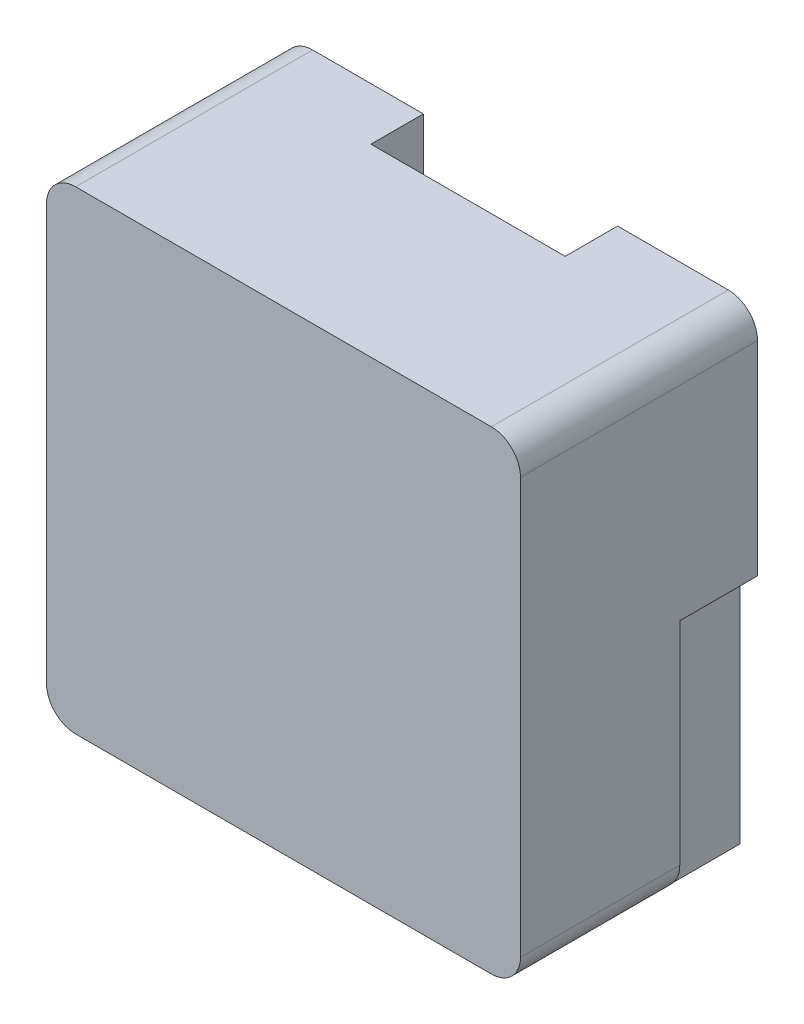
ISO-10303-21;
HEADER;
FILE_DESCRIPTION(('STEP AP214'),'2;1');
FILE_NAME('part.step','',(''),(''),'','','');
FILE_SCHEMA(('AUTOMOTIVE_DESIGN { 1 0 10303 214 1 1 1 1 }'));
ENDSEC;
DATA;
#1=APPLICATION_CONTEXT('core data for automotive mechanical design processes');
#2=APPLICATION_PROTOCOL_DEFINITION('international standard','automotive_design',2000,#1);
#3=PRODUCT_CONTEXT('',#1,'mechanical');
#4=PRODUCT('Part','Part','',(#3));
#5=PRODUCT_RELATED_PRODUCT_CATEGORY('part','',(#4));
#6=PRODUCT_DEFINITION_FORMATION('','',#4);
#7=PRODUCT_DEFINITION_CONTEXT('part definition',#1,'design');
#8=PRODUCT_DEFINITION('design','',#6,#7);
#9=PRODUCT_DEFINITION_SHAPE('','',#8);
#10=(LENGTH_UNIT() NAMED_UNIT(*) SI_UNIT(.MILLI.,.METRE.));
#11=(NAMED_UNIT(*) PLANE_ANGLE_UNIT() SI_UNIT($,.RADIAN.));
#12=(NAMED_UNIT(*) SI_UNIT($,.STERADIAN.) SOLID_ANGLE_UNIT());
#13=UNCERTAINTY_MEASURE_WITH_UNIT(LENGTH_MEASURE(1.E-05),#10,'distance_accuracy_value','');
#14=(GEOMETRIC_REPRESENTATION_CONTEXT(3) GLOBAL_UNCERTAINTY_ASSIGNED_CONTEXT((#13)) GLOBAL_UNIT_ASSIGNED_CONTEXT((#10,
#11,#12)) REPRESENTATION_CONTEXT('',''));
#15=CARTESIAN_POINT('',(0.,0.,0.));
#16=DIRECTION('',(0.,0.,1.));
#17=DIRECTION('',(1.,0.,0.));
#18=AXIS2_PLACEMENT_3D('',#15,#16,#17);
#19=CARTESIAN_POINT('',(0.,0.117632789782286,-0.508));
#20=DIRECTION('',(0.,0.,-1.));
#21=DIRECTION('',(-1.,0.,0.));
#22=AXIS2_PLACEMENT_3D('',#19,#20,#21);
#23=PLANE('',#22);
#24=CARTESIAN_POINT('',(2.7178,-2.7178,-0.508000000000003));
#25=DIRECTION('',(0.,0.,-1.));
#26=DIRECTION('',(1.,0.,0.));
#27=AXIS2_PLACEMENT_3D('',#24,#25,#26);
#28=CIRCLE('',#27,0.381);
#29=CARTESIAN_POINT('',(3.0988,-2.7178,-0.508));
#30=VERTEX_POINT('',#29);
#31=CARTESIAN_POINT('',(2.7178,-3.0988,-0.508));
#32=VERTEX_POINT('',#31);
#33=EDGE_CURVE('E11',#30,#32,#28,.T.);
#34=ORIENTED_EDGE('',*,*,#33,.F.);
#35=DIRECTION('',(0.,-1.,0.));
#36=VECTOR('',#35,1.);
#37=CARTESIAN_POINT('',(3.0988,-1.4905836051089,-0.508));
#38=LINE('',#37,#36);
#39=CARTESIAN_POINT('',(3.0988,2.7178,-0.508));
#40=VERTEX_POINT('',#39);
#41=EDGE_CURVE('E24',#40,#30,#38,.T.);
#42=ORIENTED_EDGE('',*,*,#41,.F.);
#43=CARTESIAN_POINT('',(2.7178,2.7178,-0.508000000000003));
#44=DIRECTION('',(0.,0.,-1.));
#45=DIRECTION('',(0.,1.,0.));
#46=AXIS2_PLACEMENT_3D('',#43,#44,#45);
#47=CIRCLE('',#46,0.381);
#48=CARTESIAN_POINT('',(2.7178,3.0988,-0.508));
#49=VERTEX_POINT('',#48);
#50=EDGE_CURVE('E299',#49,#40,#47,.T.);
#51=ORIENTED_EDGE('',*,*,#50,.F.);
#52=DIRECTION('',(1.,0.,0.));
#53=VECTOR('',#52,1.);
#54=CARTESIAN_POINT('',(1.5494,3.0988,-0.508));
#55=LINE('',#54,#53);
#56=CARTESIAN_POINT('',(-2.7178,3.0988,-0.508));
#57=VERTEX_POINT('',#56);
#58=EDGE_CURVE('E296',#57,#49,#55,.T.);
#59=ORIENTED_EDGE('',*,*,#58,.F.);
#60=CARTESIAN_POINT('',(-2.7178,2.7178,-0.508000000000003));
#61=DIRECTION('',(0.,0.,-1.));
#62=DIRECTION('',(-1.,0.,0.));
#63=AXIS2_PLACEMENT_3D('',#60,#61,#62);
#64=CIRCLE('',#63,0.381);
#65=CARTESIAN_POINT('',(-3.0988,2.7178,-0.508));
#66=VERTEX_POINT('',#65);
#67=EDGE_CURVE('E293',#66,#57,#64,.T.);
#68=ORIENTED_EDGE('',*,*,#67,.F.);
#69=DIRECTION('',(0.,1.,0.));
#70=VECTOR('',#69,1.);
#71=CARTESIAN_POINT('',(-3.0988,1.6082163948911,-0.508));
#72=LINE('',#71,#70);
#73=CARTESIAN_POINT('',(-3.0988,-2.7178,-0.508));
#74=VERTEX_POINT('',#73);
#75=EDGE_CURVE('E290',#74,#66,#72,.T.);
#76=ORIENTED_EDGE('',*,*,#75,.F.);
#77=CARTESIAN_POINT('',(-2.7178,-2.7178,-0.508000000000003));
#78=DIRECTION('',(0.,0.,-1.));
#79=DIRECTION('',(0.,-1.,0.));
#80=AXIS2_PLACEMENT_3D('',#77,#78,#79);
#81=CIRCLE('',#80,0.381);
#82=CARTESIAN_POINT('',(-2.7178,-3.0988,-0.508));
#83=VERTEX_POINT('',#82);
#84=EDGE_CURVE('E287',#83,#74,#81,.T.);
#85=ORIENTED_EDGE('',*,*,#84,.F.);
#86=DIRECTION('',(-1.,0.,0.));
#87=VECTOR('',#86,1.);
#88=CARTESIAN_POINT('',(-1.5494,-3.0988,-0.508));
#89=LINE('',#88,#87);
#90=EDGE_CURVE('E285',#32,#83,#89,.T.);
#91=ORIENTED_EDGE('',*,*,#90,.F.);
#92=EDGE_LOOP('',(#34,#42,#51,#59,#68,#76,#85,#91));
#93=FACE_BOUND('',#92,.T.);
#94=ADVANCED_FACE('F17',(#93),#23,.F.);
#95=CARTESIAN_POINT('',(-2.7178,2.7178,25.8741561999999));
#96=DIRECTION('',(0.,0.,-1.));
#97=DIRECTION('',(-1.,0.,0.));
#98=AXIS2_PLACEMENT_3D('',#95,#96,#97);
#99=CYLINDRICAL_SURFACE('',#98,0.381);
#100=ORIENTED_EDGE('',*,*,#67,.T.);
#101=DIRECTION('',(0.,0.,-1.));
#102=VECTOR('',#101,1.);
#103=CARTESIAN_POINT('',(-2.7178,3.0988,0.));
#104=LINE('',#103,#102);
#105=CARTESIAN_POINT('',(-2.7178,3.0988,-3.6068));
#106=VERTEX_POINT('',#105);
#107=EDGE_CURVE('E283',#57,#106,#104,.T.);
#108=ORIENTED_EDGE('',*,*,#107,.T.);
#109=CARTESIAN_POINT('',(-2.7178,2.7178,-3.6068));
#110=DIRECTION('',(0.,0.,-1.));
#111=DIRECTION('',(-1.,0.,0.));
#112=AXIS2_PLACEMENT_3D('',#109,#110,#111);
#113=CIRCLE('',#112,0.381);
#114=CARTESIAN_POINT('',(-3.0988,2.7178,-3.6068));
#115=VERTEX_POINT('',#114);
#116=EDGE_CURVE('E280',#115,#106,#113,.T.);
#117=ORIENTED_EDGE('',*,*,#116,.F.);
#118=DIRECTION('',(0.,0.,-1.));
#119=VECTOR('',#118,1.);
#120=CARTESIAN_POINT('',(-3.0988,2.7178,0.));
#121=LINE('',#120,#119);
#122=EDGE_CURVE('E277',#66,#115,#121,.T.);
#123=ORIENTED_EDGE('',*,*,#122,.F.);
#124=EDGE_LOOP('',(#100,#108,#117,#123));
#125=FACE_BOUND('',#124,.T.);
#126=ADVANCED_FACE('F331',(#125),#99,.T.);
#127=CARTESIAN_POINT('',(3.0988,3.0988,0.));
#128=DIRECTION('',(0.,1.,0.));
#129=DIRECTION('',(-1.,0.,0.));
#130=AXIS2_PLACEMENT_3D('',#127,#128,#129);
#131=PLANE('',#130);
#132=ORIENTED_EDGE('',*,*,#58,.T.);
#133=DIRECTION('',(0.,0.,-1.));
#134=VECTOR('',#133,1.);
#135=CARTESIAN_POINT('',(2.7178,3.0988,0.));
#136=LINE('',#135,#134);
#137=CARTESIAN_POINT('',(2.7178,3.0988,-3.6068));
#138=VERTEX_POINT('',#137);
#139=EDGE_CURVE('E275',#49,#138,#136,.T.);
#140=ORIENTED_EDGE('',*,*,#139,.T.);
#141=DIRECTION('',(1.,0.,0.));
#142=VECTOR('',#141,1.);
#143=CARTESIAN_POINT('',(1.27,3.0988,-3.6068));
#144=LINE('',#143,#142);
#145=CARTESIAN_POINT('',(1.27,3.0988,-3.6068));
#146=VERTEX_POINT('',#145);
#147=EDGE_CURVE('E272',#146,#138,#144,.T.);
#148=ORIENTED_EDGE('',*,*,#147,.F.);
#149=DIRECTION('',(0.,0.,1.));
#150=VECTOR('',#149,1.);
#151=CARTESIAN_POINT('',(1.27,3.0988,-3.6068));
#152=LINE('',#151,#150);
#153=CARTESIAN_POINT('',(1.27,3.0988,-2.921));
#154=VERTEX_POINT('',#153);
#155=EDGE_CURVE('E270',#146,#154,#152,.T.);
#156=ORIENTED_EDGE('',*,*,#155,.T.);
#157=DIRECTION('',(1.,0.,0.));
#158=VECTOR('',#157,1.);
#159=CARTESIAN_POINT('',(-1.27,3.0988,-2.921));
#160=LINE('',#159,#158);
#161=CARTESIAN_POINT('',(-1.27,3.0988,-2.921));
#162=VERTEX_POINT('',#161);
#163=EDGE_CURVE('E168',#162,#154,#160,.T.);
#164=ORIENTED_EDGE('',*,*,#163,.F.);
#165=DIRECTION('',(0.,0.,1.));
#166=VECTOR('',#165,1.);
#167=CARTESIAN_POINT('',(-1.27,3.0988,-3.6068));
#168=LINE('',#167,#166);
#169=CARTESIAN_POINT('',(-1.27,3.0988,-3.6068));
#170=VERTEX_POINT('',#169);
#171=EDGE_CURVE('E266',#170,#162,#168,.T.);
#172=ORIENTED_EDGE('',*,*,#171,.F.);
#173=DIRECTION('',(1.,0.,0.));
#174=VECTOR('',#173,1.);
#175=CARTESIAN_POINT('',(-2.7178,3.0988,-3.6068));
#176=LINE('',#175,#174);
#177=EDGE_CURVE('E263',#106,#170,#176,.T.);
#178=ORIENTED_EDGE('',*,*,#177,.F.);
#179=ORIENTED_EDGE('',*,*,#107,.F.);
#180=EDGE_LOOP('',(#132,#140,#148,#156,#164,#172,#178,#179));
#181=FACE_BOUND('',#180,.T.);
#182=ADVANCED_FACE('F328',(#181),#131,.T.);
#183=CARTESIAN_POINT('',(2.7178,2.7178,25.8741561999999));
#184=DIRECTION('',(0.,0.,-1.));
#185=DIRECTION('',(0.,1.,0.));
#186=AXIS2_PLACEMENT_3D('',#183,#184,#185);
#187=CYLINDRICAL_SURFACE('',#186,0.381);
#188=ORIENTED_EDGE('',*,*,#50,.T.);
#189=DIRECTION('',(0.,0.,-1.));
#190=VECTOR('',#189,1.);
#191=CARTESIAN_POINT('',(3.0988,2.7178,0.));
#192=LINE('',#191,#190);
#193=CARTESIAN_POINT('',(3.0988,2.7178,-3.6068));
#194=VERTEX_POINT('',#193);
#195=EDGE_CURVE('E261',#40,#194,#192,.T.);
#196=ORIENTED_EDGE('',*,*,#195,.T.);
#197=CARTESIAN_POINT('',(2.7178,2.7178,-3.6068));
#198=DIRECTION('',(0.,0.,-1.));
#199=DIRECTION('',(0.,1.,0.));
#200=AXIS2_PLACEMENT_3D('',#197,#198,#199);
#201=CIRCLE('',#200,0.381);
#202=EDGE_CURVE('E258',#138,#194,#201,.T.);
#203=ORIENTED_EDGE('',*,*,#202,.F.);
#204=ORIENTED_EDGE('',*,*,#139,.F.);
#205=EDGE_LOOP('',(#188,#196,#203,#204));
#206=FACE_BOUND('',#205,.T.);
#207=ADVANCED_FACE('F325',(#206),#187,.T.);
#208=CARTESIAN_POINT('',(3.0988,-3.0988,0.));
#209=DIRECTION('',(1.,0.,0.));
#210=DIRECTION('',(0.,1.,0.));
#211=AXIS2_PLACEMENT_3D('',#208,#209,#210);
#212=PLANE('',#211);
#213=ORIENTED_EDGE('',*,*,#41,.T.);
#214=DIRECTION('',(0.,0.,-1.));
#215=VECTOR('',#214,1.);
#216=CARTESIAN_POINT('',(3.0988,-2.7178,0.));
#217=LINE('',#216,#215);
#218=CARTESIAN_POINT('',(3.0988,-2.7178,-2.5908));
#219=VERTEX_POINT('',#218);
#220=EDGE_CURVE('E256',#30,#219,#217,.T.);
#221=ORIENTED_EDGE('',*,*,#220,.T.);
#222=DIRECTION('',(0.,1.,0.));
#223=VECTOR('',#222,1.);
#224=CARTESIAN_POINT('',(3.0988,-2.7178,-2.5908));
#225=LINE('',#224,#223);
#226=CARTESIAN_POINT('',(3.0988,0.0508,-2.5908));
#227=VERTEX_POINT('',#226);
#228=EDGE_CURVE('E254',#219,#227,#225,.T.);
#229=ORIENTED_EDGE('',*,*,#228,.T.);
#230=DIRECTION('',(0.,0.,1.));
#231=VECTOR('',#230,1.);
#232=CARTESIAN_POINT('',(3.0988,0.0508,-3.6068));
#233=LINE('',#232,#231);
#234=CARTESIAN_POINT('',(3.0988,0.0508,-3.6068));
#235=VERTEX_POINT('',#234);
#236=EDGE_CURVE('E251',#235,#227,#233,.T.);
#237=ORIENTED_EDGE('',*,*,#236,.F.);
#238=DIRECTION('',(0.,-1.,0.));
#239=VECTOR('',#238,1.);
#240=CARTESIAN_POINT('',(3.0988,2.7178,-3.6068));
#241=LINE('',#240,#239);
#242=EDGE_CURVE('E248',#194,#235,#241,.T.);
#243=ORIENTED_EDGE('',*,*,#242,.F.);
#244=ORIENTED_EDGE('',*,*,#195,.F.);
#245=EDGE_LOOP('',(#213,#221,#229,#237,#243,#244));
#246=FACE_BOUND('',#245,.T.);
#247=ADVANCED_FACE('F303',(#246),#212,.T.);
#248=CARTESIAN_POINT('',(0.,0.,-3.6068));
#249=DIRECTION('',(0.,0.,1.));
#250=DIRECTION('',(1.,0.,0.));
#251=AXIS2_PLACEMENT_3D('',#248,#249,#250);
#252=PLANE('',#251);
#253=DIRECTION('',(0.,1.,0.));
#254=VECTOR('',#253,1.);
#255=CARTESIAN_POINT('',(-1.27,-3.0988,-3.6068));
#256=LINE('',#255,#254);
#257=CARTESIAN_POINT('',(-1.27,-3.0988,-3.6068));
#258=VERTEX_POINT('',#257);
#259=EDGE_CURVE('E245',#258,#170,#256,.T.);
#260=ORIENTED_EDGE('',*,*,#259,.F.);
#261=DIRECTION('',(-1.,0.,0.));
#262=VECTOR('',#261,1.);
#263=CARTESIAN_POINT('',(-1.27,-3.0988,-3.6068));
#264=LINE('',#263,#262);
#265=CARTESIAN_POINT('',(-2.8702,-3.0988,-3.6068));
#266=VERTEX_POINT('',#265);
#267=EDGE_CURVE('E243',#258,#266,#264,.T.);
#268=ORIENTED_EDGE('',*,*,#267,.T.);
#269=DIRECTION('',(0.,1.,0.));
#270=VECTOR('',#269,1.);
#271=CARTESIAN_POINT('',(-2.8702,-3.0988,-3.6068));
#272=LINE('',#271,#270);
#273=CARTESIAN_POINT('',(-2.8702,0.0508,-3.6068));
#274=VERTEX_POINT('',#273);
#275=EDGE_CURVE('E241',#266,#274,#272,.T.);
#276=ORIENTED_EDGE('',*,*,#275,.T.);
#277=DIRECTION('',(1.,0.,0.));
#278=VECTOR('',#277,1.);
#279=CARTESIAN_POINT('',(-3.0988,0.0508,-3.6068));
#280=LINE('',#279,#278);
#281=CARTESIAN_POINT('',(-3.0988,0.0508,-3.6068));
#282=VERTEX_POINT('',#281);
#283=EDGE_CURVE('E238',#282,#274,#280,.T.);
#284=ORIENTED_EDGE('',*,*,#283,.F.);
#285=DIRECTION('',(0.,1.,0.));
#286=VECTOR('',#285,1.);
#287=CARTESIAN_POINT('',(-3.0988,0.0508,-3.6068));
#288=LINE('',#287,#286);
#289=EDGE_CURVE('E235',#282,#115,#288,.T.);
#290=ORIENTED_EDGE('',*,*,#289,.T.);
#291=ORIENTED_EDGE('',*,*,#116,.T.);
#292=ORIENTED_EDGE('',*,*,#177,.T.);
#293=EDGE_LOOP('',(#260,#268,#276,#284,#290,#291,#292));
#294=FACE_BOUND('',#293,.T.);
#295=ADVANCED_FACE('F334',(#294),#252,.F.);
#296=CARTESIAN_POINT('',(0.,0.,-3.6068));
#297=DIRECTION('',(0.,0.,1.));
#298=DIRECTION('',(1.,0.,0.));
#299=AXIS2_PLACEMENT_3D('',#296,#297,#298);
#300=PLANE('',#299);
#301=DIRECTION('',(0.,1.,0.));
#302=VECTOR('',#301,1.);
#303=CARTESIAN_POINT('',(2.8702,-3.0988,-3.6068));
#304=LINE('',#303,#302);
#305=CARTESIAN_POINT('',(2.8702,-3.0988,-3.6068));
#306=VERTEX_POINT('',#305);
#307=CARTESIAN_POINT('',(2.8702,0.0508,-3.6068));
#308=VERTEX_POINT('',#307);
#309=EDGE_CURVE('E233',#306,#308,#304,.T.);
#310=ORIENTED_EDGE('',*,*,#309,.F.);
#311=DIRECTION('',(-1.,0.,0.));
#312=VECTOR('',#311,1.);
#313=CARTESIAN_POINT('',(2.8702,-3.0988,-3.6068));
#314=LINE('',#313,#312);
#315=CARTESIAN_POINT('',(1.27,-3.0988,-3.6068));
#316=VERTEX_POINT('',#315);
#317=EDGE_CURVE('E231',#306,#316,#314,.T.);
#318=ORIENTED_EDGE('',*,*,#317,.T.);
#319=DIRECTION('',(0.,1.,0.));
#320=VECTOR('',#319,1.);
#321=CARTESIAN_POINT('',(1.27,-3.0988,-3.6068));
#322=LINE('',#321,#320);
#323=EDGE_CURVE('E164',#316,#146,#322,.T.);
#324=ORIENTED_EDGE('',*,*,#323,.T.);
#325=ORIENTED_EDGE('',*,*,#147,.T.);
#326=ORIENTED_EDGE('',*,*,#202,.T.);
#327=ORIENTED_EDGE('',*,*,#242,.T.);
#328=DIRECTION('',(-1.,0.,0.));
#329=VECTOR('',#328,1.);
#330=CARTESIAN_POINT('',(3.0988,0.0508,-3.6068));
#331=LINE('',#330,#329);
#332=EDGE_CURVE('E227',#235,#308,#331,.T.);
#333=ORIENTED_EDGE('',*,*,#332,.T.);
#334=EDGE_LOOP('',(#310,#318,#324,#325,#326,#327,#333));
#335=FACE_BOUND('',#334,.T.);
#336=ADVANCED_FACE('F321',(#335),#300,.F.);
#337=CARTESIAN_POINT('',(-3.0988,3.0988,0.));
#338=DIRECTION('',(-1.,0.,0.));
#339=DIRECTION('',(0.,-1.,0.));
#340=AXIS2_PLACEMENT_3D('',#337,#338,#339);
#341=PLANE('',#340);
#342=ORIENTED_EDGE('',*,*,#75,.T.);
#343=ORIENTED_EDGE('',*,*,#122,.T.);
#344=ORIENTED_EDGE('',*,*,#289,.F.);
#345=DIRECTION('',(0.,0.,1.));
#346=VECTOR('',#345,1.);
#347=CARTESIAN_POINT('',(-3.0988,0.0508,-3.6068));
#348=LINE('',#347,#346);
#349=CARTESIAN_POINT('',(-3.0988,0.0508,-2.5908));
#350=VERTEX_POINT('',#349);
#351=EDGE_CURVE('E225',#282,#350,#348,.T.);
#352=ORIENTED_EDGE('',*,*,#351,.T.);
#353=DIRECTION('',(0.,1.,0.));
#354=VECTOR('',#353,1.);
#355=CARTESIAN_POINT('',(-3.0988,-2.7178,-2.5908));
#356=LINE('',#355,#354);
#357=CARTESIAN_POINT('',(-3.0988,-2.7178,-2.5908));
#358=VERTEX_POINT('',#357);
#359=EDGE_CURVE('E222',#358,#350,#356,.T.);
#360=ORIENTED_EDGE('',*,*,#359,.F.);
#361=DIRECTION('',(0.,0.,-1.));
#362=VECTOR('',#361,1.);
#363=CARTESIAN_POINT('',(-3.0988,-2.7178,0.));
#364=LINE('',#363,#362);
#365=EDGE_CURVE('E219',#74,#358,#364,.T.);
#366=ORIENTED_EDGE('',*,*,#365,.F.);
#367=EDGE_LOOP('',(#342,#343,#344,#352,#360,#366));
#368=FACE_BOUND('',#367,.T.);
#369=ADVANCED_FACE('F338',(#368),#341,.T.);
#370=CARTESIAN_POINT('',(-2.7178,-2.7178,25.8741561999999));
#371=DIRECTION('',(0.,0.,-1.));
#372=DIRECTION('',(0.,-1.,0.));
#373=AXIS2_PLACEMENT_3D('',#370,#371,#372);
#374=CYLINDRICAL_SURFACE('',#373,0.381);
#375=ORIENTED_EDGE('',*,*,#84,.T.);
#376=ORIENTED_EDGE('',*,*,#365,.T.);
#377=CARTESIAN_POINT('',(-2.7178,-2.7178,-2.5908));
#378=DIRECTION('',(0.,0.,-1.));
#379=DIRECTION('',(-0.399999999999988,-0.916515138991173,0.));
#380=AXIS2_PLACEMENT_3D('',#377,#378,#379);
#381=CIRCLE('',#380,0.381);
#382=CARTESIAN_POINT('',(-2.8702,-3.066992267956,-2.5908));
#383=VERTEX_POINT('',#382);
#384=EDGE_CURVE('E216',#383,#358,#381,.T.);
#385=ORIENTED_EDGE('',*,*,#384,.F.);
#386=CARTESIAN_POINT('',(-2.7178,-2.7178,-2.5908));
#387=DIRECTION('',(0.,0.,-1.));
#388=DIRECTION('',(0.,-1.,0.));
#389=AXIS2_PLACEMENT_3D('',#386,#387,#388);
#390=CIRCLE('',#389,0.381);
#391=CARTESIAN_POINT('',(-2.7178,-3.0988,-2.5908));
#392=VERTEX_POINT('',#391);
#393=EDGE_CURVE('E213',#392,#383,#390,.T.);
#394=ORIENTED_EDGE('',*,*,#393,.F.);
#395=DIRECTION('',(0.,0.,-1.));
#396=VECTOR('',#395,1.);
#397=CARTESIAN_POINT('',(-2.7178,-3.0988,0.));
#398=LINE('',#397,#396);
#399=EDGE_CURVE('E210',#83,#392,#398,.T.);
#400=ORIENTED_EDGE('',*,*,#399,.F.);
#401=EDGE_LOOP('',(#375,#376,#385,#394,#400));
#402=FACE_BOUND('',#401,.T.);
#403=ADVANCED_FACE('F360',(#402),#374,.T.);
#404=CARTESIAN_POINT('',(0.,0.,-2.5908));
#405=DIRECTION('',(0.,0.,-1.));
#406=DIRECTION('',(1.,0.,0.));
#407=AXIS2_PLACEMENT_3D('',#404,#405,#406);
#408=PLANE('',#407);
#409=CARTESIAN_POINT('',(2.7178,-2.7178,-2.5908));
#410=DIRECTION('',(0.,0.,-1.));
#411=DIRECTION('',(1.,0.,0.));
#412=AXIS2_PLACEMENT_3D('',#409,#410,#411);
#413=CIRCLE('',#412,0.381);
#414=CARTESIAN_POINT('',(2.8702,-3.066992267956,-2.5908));
#415=VERTEX_POINT('',#414);
#416=EDGE_CURVE('E208',#219,#415,#413,.T.);
#417=ORIENTED_EDGE('',*,*,#416,.T.);
#418=DIRECTION('',(0.,1.,0.));
#419=VECTOR('',#418,1.);
#420=CARTESIAN_POINT('',(2.8702,-3.066992267956,-2.5908));
#421=LINE('',#420,#419);
#422=CARTESIAN_POINT('',(2.8702,0.0508,-2.5908));
#423=VERTEX_POINT('',#422);
#424=EDGE_CURVE('E206',#415,#423,#421,.T.);
#425=ORIENTED_EDGE('',*,*,#424,.T.);
#426=DIRECTION('',(1.,0.,0.));
#427=VECTOR('',#426,1.);
#428=CARTESIAN_POINT('',(2.8702,0.0508,-2.5908));
#429=LINE('',#428,#427);
#430=EDGE_CURVE('E203',#423,#227,#429,.T.);
#431=ORIENTED_EDGE('',*,*,#430,.T.);
#432=ORIENTED_EDGE('',*,*,#228,.F.);
#433=EDGE_LOOP('',(#417,#425,#431,#432));
#434=FACE_BOUND('',#433,.T.);
#435=ADVANCED_FACE('F311',(#434),#408,.T.);
#436=CARTESIAN_POINT('',(0.,0.,-2.5908));
#437=DIRECTION('',(0.,0.,-1.));
#438=DIRECTION('',(1.,0.,0.));
#439=AXIS2_PLACEMENT_3D('',#436,#437,#438);
#440=PLANE('',#439);
#441=ORIENTED_EDGE('',*,*,#384,.T.);
#442=ORIENTED_EDGE('',*,*,#359,.T.);
#443=DIRECTION('',(1.,0.,0.));
#444=VECTOR('',#443,1.);
#445=CARTESIAN_POINT('',(-3.0988,0.0508,-2.5908));
#446=LINE('',#445,#444);
#447=CARTESIAN_POINT('',(-2.8702,0.0508,-2.5908));
#448=VERTEX_POINT('',#447);
#449=EDGE_CURVE('E201',#350,#448,#446,.T.);
#450=ORIENTED_EDGE('',*,*,#449,.T.);
#451=DIRECTION('',(0.,-1.,0.));
#452=VECTOR('',#451,1.);
#453=CARTESIAN_POINT('',(-2.8702,0.0508,-2.5908));
#454=LINE('',#453,#452);
#455=EDGE_CURVE('E198',#448,#383,#454,.T.);
#456=ORIENTED_EDGE('',*,*,#455,.T.);
#457=EDGE_LOOP('',(#441,#442,#450,#456));
#458=FACE_BOUND('',#457,.T.);
#459=ADVANCED_FACE('F347',(#458),#440,.T.);
#460=CARTESIAN_POINT('',(2.7178,-2.7178,25.8741561999999));
#461=DIRECTION('',(0.,0.,-1.));
#462=DIRECTION('',(1.,0.,0.));
#463=AXIS2_PLACEMENT_3D('',#460,#461,#462);
#464=CYLINDRICAL_SURFACE('',#463,0.381);
#465=ORIENTED_EDGE('',*,*,#33,.T.);
#466=DIRECTION('',(0.,0.,-1.));
#467=VECTOR('',#466,1.);
#468=CARTESIAN_POINT('',(2.7178,-3.0988,0.));
#469=LINE('',#468,#467);
#470=CARTESIAN_POINT('',(2.7178,-3.0988,-2.5908));
#471=VERTEX_POINT('',#470);
#472=EDGE_CURVE('E196',#32,#471,#469,.T.);
#473=ORIENTED_EDGE('',*,*,#472,.T.);
#474=CARTESIAN_POINT('',(2.7178,-2.7178,-2.5908));
#475=DIRECTION('',(0.,0.,-1.));
#476=DIRECTION('',(0.399999999999988,-0.916515138991173,0.));
#477=AXIS2_PLACEMENT_3D('',#474,#475,#476);
#478=CIRCLE('',#477,0.381);
#479=EDGE_CURVE('E193',#415,#471,#478,.T.);
#480=ORIENTED_EDGE('',*,*,#479,.F.);
#481=ORIENTED_EDGE('',*,*,#416,.F.);
#482=ORIENTED_EDGE('',*,*,#220,.F.);
#483=EDGE_LOOP('',(#465,#473,#480,#481,#482));
#484=FACE_BOUND('',#483,.T.);
#485=ADVANCED_FACE('F307',(#484),#464,.T.);
#486=CARTESIAN_POINT('',(0.,0.,-2.5908));
#487=DIRECTION('',(0.,0.,-1.));
#488=DIRECTION('',(1.,0.,0.));
#489=AXIS2_PLACEMENT_3D('',#486,#487,#488);
#490=PLANE('',#489);
#491=DIRECTION('',(0.,1.,0.));
#492=VECTOR('',#491,1.);
#493=CARTESIAN_POINT('',(2.8702,-3.0988,-2.5908));
#494=LINE('',#493,#492);
#495=CARTESIAN_POINT('',(2.8702,-3.0988,-2.5908));
#496=VERTEX_POINT('',#495);
#497=EDGE_CURVE('E190',#496,#415,#494,.T.);
#498=ORIENTED_EDGE('',*,*,#497,.T.);
#499=ORIENTED_EDGE('',*,*,#479,.T.);
#500=DIRECTION('',(1.,0.,0.));
#501=VECTOR('',#500,1.);
#502=CARTESIAN_POINT('',(2.7178,-3.0988,-2.5908));
#503=LINE('',#502,#501);
#504=EDGE_CURVE('E187',#471,#496,#503,.T.);
#505=ORIENTED_EDGE('',*,*,#504,.T.);
#506=EDGE_LOOP('',(#498,#499,#505));
#507=FACE_BOUND('',#506,.T.);
#508=ADVANCED_FACE('F365',(#507),#490,.F.);
#509=CARTESIAN_POINT('',(2.8702,-3.0988,-3.6068));
#510=DIRECTION('',(-1.,0.,0.));
#511=DIRECTION('',(0.,1.,0.));
#512=AXIS2_PLACEMENT_3D('',#509,#510,#511);
#513=PLANE('',#512);
#514=ORIENTED_EDGE('',*,*,#497,.F.);
#515=DIRECTION('',(0.,0.,1.));
#516=VECTOR('',#515,1.);
#517=CARTESIAN_POINT('',(2.8702,-3.0988,-3.6068));
#518=LINE('',#517,#516);
#519=EDGE_CURVE('E184',#306,#496,#518,.T.);
#520=ORIENTED_EDGE('',*,*,#519,.F.);
#521=ORIENTED_EDGE('',*,*,#309,.T.);
#522=DIRECTION('',(0.,0.,1.));
#523=VECTOR('',#522,1.);
#524=CARTESIAN_POINT('',(2.8702,0.0508,-3.6068));
#525=LINE('',#524,#523);
#526=EDGE_CURVE('E181',#308,#423,#525,.T.);
#527=ORIENTED_EDGE('',*,*,#526,.T.);
#528=ORIENTED_EDGE('',*,*,#424,.F.);
#529=EDGE_LOOP('',(#514,#520,#521,#527,#528));
#530=FACE_BOUND('',#529,.T.);
#531=ADVANCED_FACE('F314',(#530),#513,.F.);
#532=CARTESIAN_POINT('',(2.8702,0.0508,-3.6068));
#533=DIRECTION('',(0.,1.,0.));
#534=DIRECTION('',(1.,0.,0.));
#535=AXIS2_PLACEMENT_3D('',#532,#533,#534);
#536=PLANE('',#535);
#537=ORIENTED_EDGE('',*,*,#332,.F.);
#538=ORIENTED_EDGE('',*,*,#236,.T.);
#539=ORIENTED_EDGE('',*,*,#430,.F.);
#540=ORIENTED_EDGE('',*,*,#526,.F.);
#541=EDGE_LOOP('',(#537,#538,#539,#540));
#542=FACE_BOUND('',#541,.T.);
#543=ADVANCED_FACE('F319',(#542),#536,.F.);
#544=CARTESIAN_POINT('',(-3.0988,-3.0988,0.));
#545=DIRECTION('',(0.,-1.,0.));
#546=DIRECTION('',(1.,0.,0.));
#547=AXIS2_PLACEMENT_3D('',#544,#545,#546);
#548=PLANE('',#547);
#549=ORIENTED_EDGE('',*,*,#90,.T.);
#550=ORIENTED_EDGE('',*,*,#399,.T.);
#551=DIRECTION('',(-1.,0.,0.));
#552=VECTOR('',#551,1.);
#553=CARTESIAN_POINT('',(-2.7178,-3.0988,-2.5908));
#554=LINE('',#553,#552);
#555=CARTESIAN_POINT('',(-2.8702,-3.0988,-2.5908));
#556=VERTEX_POINT('',#555);
#557=EDGE_CURVE('E179',#392,#556,#554,.T.);
#558=ORIENTED_EDGE('',*,*,#557,.T.);
#559=DIRECTION('',(0.,0.,1.));
#560=VECTOR('',#559,1.);
#561=CARTESIAN_POINT('',(-2.8702,-3.0988,-3.6068));
#562=LINE('',#561,#560);
#563=EDGE_CURVE('E176',#266,#556,#562,.T.);
#564=ORIENTED_EDGE('',*,*,#563,.F.);
#565=ORIENTED_EDGE('',*,*,#267,.F.);
#566=DIRECTION('',(0.,0.,1.));
#567=VECTOR('',#566,1.);
#568=CARTESIAN_POINT('',(-1.27,-3.0988,-3.6068));
#569=LINE('',#568,#567);
#570=CARTESIAN_POINT('',(-1.27,-3.0988,-2.921));
#571=VERTEX_POINT('',#570);
#572=EDGE_CURVE('E151',#258,#571,#569,.T.);
#573=ORIENTED_EDGE('',*,*,#572,.T.);
#574=DIRECTION('',(1.,0.,0.));
#575=VECTOR('',#574,1.);
#576=CARTESIAN_POINT('',(-1.27,-3.0988,-2.921));
#577=LINE('',#576,#575);
#578=CARTESIAN_POINT('',(1.27,-3.0988,-2.921));
#579=VERTEX_POINT('',#578);
#580=EDGE_CURVE('E143',#571,#579,#577,.T.);
#581=ORIENTED_EDGE('',*,*,#580,.T.);
#582=DIRECTION('',(0.,0.,1.));
#583=VECTOR('',#582,1.);
#584=CARTESIAN_POINT('',(1.27,-3.0988,-3.6068));
#585=LINE('',#584,#583);
#586=EDGE_CURVE('E148',#316,#579,#585,.T.);
#587=ORIENTED_EDGE('',*,*,#586,.F.);
#588=ORIENTED_EDGE('',*,*,#317,.F.);
#589=ORIENTED_EDGE('',*,*,#519,.T.);
#590=ORIENTED_EDGE('',*,*,#504,.F.);
#591=ORIENTED_EDGE('',*,*,#472,.F.);
#592=EDGE_LOOP('',(#549,#550,#558,#564,#565,#573,#581,#587,#588,#589,#590,#591));
#593=FACE_BOUND('',#592,.T.);
#594=ADVANCED_FACE('F146',(#593),#548,.T.);
#595=CARTESIAN_POINT('',(1.27,-3.71856,-2.921));
#596=DIRECTION('',(1.,0.,0.));
#597=DIRECTION('',(0.,0.,-1.));
#598=AXIS2_PLACEMENT_3D('',#595,#596,#597);
#599=PLANE('',#598);
#600=ORIENTED_EDGE('',*,*,#323,.F.);
#601=ORIENTED_EDGE('',*,*,#586,.T.);
#602=DIRECTION('',(0.,1.,0.));
#603=VECTOR('',#602,1.);
#604=CARTESIAN_POINT('',(1.27,-3.0988,-2.921));
#605=LINE('',#604,#603);
#606=EDGE_CURVE('E162',#579,#154,#605,.T.);
#607=ORIENTED_EDGE('',*,*,#606,.T.);
#608=ORIENTED_EDGE('',*,*,#155,.F.);
#609=EDGE_LOOP('',(#600,#601,#607,#608));
#610=FACE_BOUND('',#609,.T.);
#611=ADVANCED_FACE('F160',(#610),#599,.F.);
#612=CARTESIAN_POINT('',(-1.27,-3.71856,-2.921));
#613=DIRECTION('',(0.,0.,1.));
#614=DIRECTION('',(1.,0.,0.));
#615=AXIS2_PLACEMENT_3D('',#612,#613,#614);
#616=PLANE('',#615);
#617=ORIENTED_EDGE('',*,*,#580,.F.);
#618=DIRECTION('',(0.,1.,0.));
#619=VECTOR('',#618,1.);
#620=CARTESIAN_POINT('',(-1.27,-3.0988,-2.921));
#621=LINE('',#620,#619);
#622=EDGE_CURVE('E169',#571,#162,#621,.T.);
#623=ORIENTED_EDGE('',*,*,#622,.T.);
#624=ORIENTED_EDGE('',*,*,#163,.T.);
#625=ORIENTED_EDGE('',*,*,#606,.F.);
#626=EDGE_LOOP('',(#617,#623,#624,#625));
#627=FACE_BOUND('',#626,.T.);
#628=ADVANCED_FACE('F167',(#627),#616,.F.);
#629=CARTESIAN_POINT('',(-1.27,-3.71856,-3.6068));
#630=DIRECTION('',(-1.,0.,0.));
#631=DIRECTION('',(0.,0.,1.));
#632=AXIS2_PLACEMENT_3D('',#629,#630,#631);
#633=PLANE('',#632);
#634=ORIENTED_EDGE('',*,*,#259,.T.);
#635=ORIENTED_EDGE('',*,*,#171,.T.);
#636=ORIENTED_EDGE('',*,*,#622,.F.);
#637=ORIENTED_EDGE('',*,*,#572,.F.);
#638=EDGE_LOOP('',(#634,#635,#636,#637));
#639=FACE_BOUND('',#638,.T.);
#640=ADVANCED_FACE('F455',(#639),#633,.F.);
#641=CARTESIAN_POINT('',(-2.8702,0.0508,-3.6068));
#642=DIRECTION('',(1.,0.,0.));
#643=DIRECTION('',(0.,-1.,0.));
#644=AXIS2_PLACEMENT_3D('',#641,#642,#643);
#645=PLANE('',#644);
#646=DIRECTION('',(0.,-1.,0.));
#647=VECTOR('',#646,1.);
#648=CARTESIAN_POINT('',(-2.8702,-3.066992267956,-2.5908));
#649=LINE('',#648,#647);
#650=EDGE_CURVE('E171',#383,#556,#649,.T.);
#651=ORIENTED_EDGE('',*,*,#650,.F.);
#652=ORIENTED_EDGE('',*,*,#455,.F.);
#653=DIRECTION('',(0.,0.,1.));
#654=VECTOR('',#653,1.);
#655=CARTESIAN_POINT('',(-2.8702,0.0508,-3.6068));
#656=LINE('',#655,#654);
#657=EDGE_CURVE('E344',#274,#448,#656,.T.);
#658=ORIENTED_EDGE('',*,*,#657,.F.);
#659=ORIENTED_EDGE('',*,*,#275,.F.);
#660=ORIENTED_EDGE('',*,*,#563,.T.);
#661=EDGE_LOOP('',(#651,#652,#658,#659,#660));
#662=FACE_BOUND('',#661,.T.);
#663=ADVANCED_FACE('F350',(#662),#645,.F.);
#664=CARTESIAN_POINT('',(0.,0.,-2.5908));
#665=DIRECTION('',(0.,0.,-1.));
#666=DIRECTION('',(1.,0.,0.));
#667=AXIS2_PLACEMENT_3D('',#664,#665,#666);
#668=PLANE('',#667);
#669=ORIENTED_EDGE('',*,*,#557,.F.);
#670=ORIENTED_EDGE('',*,*,#393,.T.);
#671=ORIENTED_EDGE('',*,*,#650,.T.);
#672=EDGE_LOOP('',(#669,#670,#671));
#673=FACE_BOUND('',#672,.T.);
#674=ADVANCED_FACE('F357',(#673),#668,.F.);
#675=CARTESIAN_POINT('',(-3.0988,0.0508,-3.6068));
#676=DIRECTION('',(0.,1.,0.));
#677=DIRECTION('',(1.,0.,0.));
#678=AXIS2_PLACEMENT_3D('',#675,#676,#677);
#679=PLANE('',#678);
#680=ORIENTED_EDGE('',*,*,#283,.T.);
#681=ORIENTED_EDGE('',*,*,#657,.T.);
#682=ORIENTED_EDGE('',*,*,#449,.F.);
#683=ORIENTED_EDGE('',*,*,#351,.F.);
#684=EDGE_LOOP('',(#680,#681,#682,#683));
#685=FACE_BOUND('',#684,.T.);
#686=ADVANCED_FACE('F341',(#685),#679,.F.);
#687=CLOSED_SHELL('',(#94,#126,#182,#207,#247,#295,#336,#369,#403,#435,#459,#485,#508,#531,#543,
#594,#611,#628,#640,#663,#674,#686));
#688=MANIFOLD_SOLID_BREP('B1',#687);
#689=ADVANCED_BREP_SHAPE_REPRESENTATION('',(#18,#688),#14);
#690=SHAPE_DEFINITION_REPRESENTATION(#9,#689);
ENDSEC;
END-ISO-10303-21;
